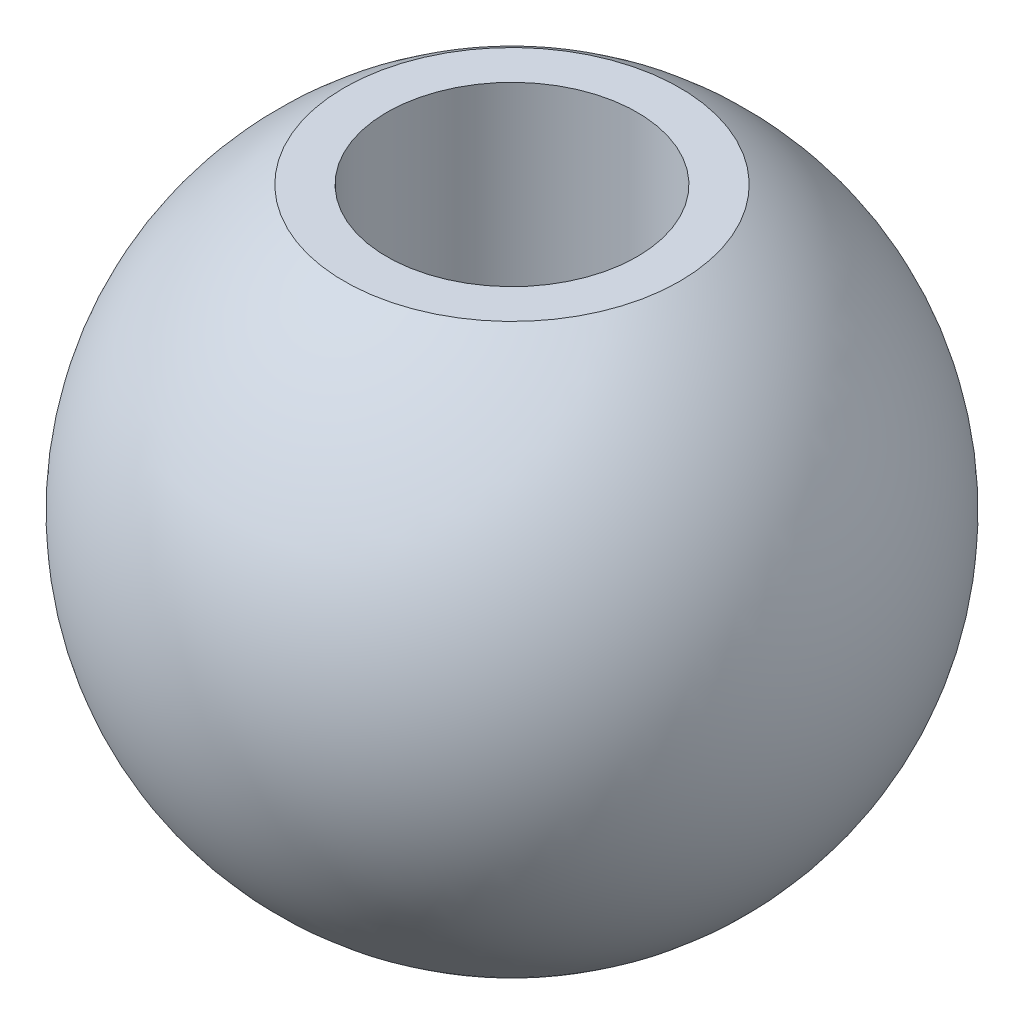
ISO-10303-21;
HEADER;
FILE_DESCRIPTION(('STEP AP214'),'2;1');
FILE_NAME('part.step','',(''),(''),'','','');
FILE_SCHEMA(('AUTOMOTIVE_DESIGN { 1 0 10303 214 1 1 1 1 }'));
ENDSEC;
DATA;
#1=APPLICATION_CONTEXT('core data for automotive mechanical design processes');
#2=APPLICATION_PROTOCOL_DEFINITION('international standard','automotive_design',2000,#1);
#3=PRODUCT_CONTEXT('',#1,'mechanical');
#4=PRODUCT('Part','Part','',(#3));
#5=PRODUCT_RELATED_PRODUCT_CATEGORY('part','',(#4));
#6=PRODUCT_DEFINITION_FORMATION('','',#4);
#7=PRODUCT_DEFINITION_CONTEXT('part definition',#1,'design');
#8=PRODUCT_DEFINITION('design','',#6,#7);
#9=PRODUCT_DEFINITION_SHAPE('','',#8);
#10=(LENGTH_UNIT() NAMED_UNIT(*) SI_UNIT(.MILLI.,.METRE.));
#11=(NAMED_UNIT(*) PLANE_ANGLE_UNIT() SI_UNIT($,.RADIAN.));
#12=(NAMED_UNIT(*) SI_UNIT($,.STERADIAN.) SOLID_ANGLE_UNIT());
#13=UNCERTAINTY_MEASURE_WITH_UNIT(LENGTH_MEASURE(1.E-05),#10,'distance_accuracy_value','');
#14=(GEOMETRIC_REPRESENTATION_CONTEXT(3) GLOBAL_UNCERTAINTY_ASSIGNED_CONTEXT((#13)) GLOBAL_UNIT_ASSIGNED_CONTEXT((#10,
#11,#12)) REPRESENTATION_CONTEXT('',''));
#15=CARTESIAN_POINT('',(0.,0.,0.));
#16=DIRECTION('',(0.,0.,1.));
#17=DIRECTION('',(1.,0.,0.));
#18=AXIS2_PLACEMENT_3D('',#15,#16,#17);
#19=CARTESIAN_POINT('',(0.,0.,0.));
#20=DIRECTION('',(0.,1.,0.));
#21=DIRECTION('',(1.,0.,0.));
#22=AXIS2_PLACEMENT_3D('',#19,#20,#21);
#23=SPHERICAL_SURFACE('',#22,3.95);
#24=CARTESIAN_POINT('',(0.,3.4,0.));
#25=DIRECTION('',(0.,1.,0.));
#26=DIRECTION('',(-1.,0.,0.));
#27=AXIS2_PLACEMENT_3D('',#24,#25,#26);
#28=CIRCLE('',#27,2.01059692628831);
#29=CARTESIAN_POINT('',(2.01059692628831,3.4,0.));
#30=VERTEX_POINT('',#29);
#31=EDGE_CURVE('E44',#30,#30,#28,.T.);
#32=CARTESIAN_POINT('',(0.,-3.4,0.));
#33=DIRECTION('',(0.,1.,0.));
#34=DIRECTION('',(-1.,0.,0.));
#35=AXIS2_PLACEMENT_3D('',#32,#33,#34);
#36=CIRCLE('',#35,2.01059692628831);
#37=CARTESIAN_POINT('',(2.01059692628831,-3.4,0.));
#38=VERTEX_POINT('',#37);
#39=EDGE_CURVE('E10',#38,#38,#36,.T.);
#40=CARTESIAN_POINT('',(2.01059692628831,3.4,0.));
#41=CARTESIAN_POINT('',(2.08403642727924,3.3565762334065,0.));
#42=CARTESIAN_POINT('',(2.15606437943938,3.31076639949149,0.));
#43=CARTESIAN_POINT('',(2.29700517886713,3.21458198269347,0.));
#44=CARTESIAN_POINT('',(2.36591802613475,3.16420739981045,0.));
#45=CARTESIAN_POINT('',(2.50033660854649,3.05910087075139,0.));
#46=CARTESIAN_POINT('',(2.56584234369062,3.00436892457535,0.));
#47=CARTESIAN_POINT('',(2.69317249851169,2.890778477271,0.));
#48=CARTESIAN_POINT('',(2.75499691818862,2.83191997614268,0.));
#49=CARTESIAN_POINT('',(2.87470475138612,2.71032317186042,0.));
#50=CARTESIAN_POINT('',(2.93258816490669,2.64758486870647,0.));
#51=CARTESIAN_POINT('',(3.04417108800817,2.51849186636983,0.));
#52=CARTESIAN_POINT('',(3.09787059758909,2.45213716718715,0.));
#53=CARTESIAN_POINT('',(3.20086030850501,2.3160898589322,0.));
#54=CARTESIAN_POINT('',(3.25015050984,2.24639724985994,0.));
#55=CARTESIAN_POINT('',(3.34411472496936,2.10396664445794,0.));
#56=CARTESIAN_POINT('',(3.38878873876373,2.0312286481282,0.));
#57=CARTESIAN_POINT('',(3.47333306995387,1.88301256599266,0.));
#58=CARTESIAN_POINT('',(3.51320338734965,1.80753448018685,0.));
#59=CARTESIAN_POINT('',(3.58797298047779,1.65415501961077,0.));
#60=CARTESIAN_POINT('',(3.62287225621014,1.57625364484049,0.));
#61=CARTESIAN_POINT('',(3.68755328508499,1.41835457747838,0.));
#62=CARTESIAN_POINT('',(3.71733503822748,1.33835688488654,0.));
#63=CARTESIAN_POINT('',(3.77165602059157,1.17660095192271,0.));
#64=CARTESIAN_POINT('',(3.79619524981317,1.09484271155071,0.));
#65=CARTESIAN_POINT('',(3.83992818714321,0.92990884248388,0.));
#66=CARTESIAN_POINT('',(3.85912189525164,0.84673321378905,0.));
#67=CARTESIAN_POINT('',(3.89208322963802,0.67931367667147,0.));
#68=CARTESIAN_POINT('',(3.90585085591597,0.59506976824872,0.));
#69=CARTESIAN_POINT('',(3.92790224052368,0.425867264100632,0.));
#70=CARTESIAN_POINT('',(3.93618599885345,0.340908668375294,0.));
#71=CARTESIAN_POINT('',(3.94723487859161,0.170633381766637,0.));
#72=CARTESIAN_POINT('',(3.95,0.0853166908833184,0.));
#73=CARTESIAN_POINT('',(3.95,-0.0853166908833185,0.));
#74=CARTESIAN_POINT('',(3.94723487859161,-0.170633381766637,0.));
#75=CARTESIAN_POINT('',(3.93618599885345,-0.340908668375294,0.));
#76=CARTESIAN_POINT('',(3.92790224052368,-0.425867264100632,0.));
#77=CARTESIAN_POINT('',(3.90585085591596,-0.595069768248721,0.));
#78=CARTESIAN_POINT('',(3.89208322963802,-0.679313676671471,0.));
#79=CARTESIAN_POINT('',(3.85912189525164,-0.84673321378905,0.));
#80=CARTESIAN_POINT('',(3.83992818714321,-0.92990884248388,0.));
#81=CARTESIAN_POINT('',(3.79619524981317,-1.09484271155071,0.));
#82=CARTESIAN_POINT('',(3.77165602059157,-1.17660095192271,0.));
#83=CARTESIAN_POINT('',(3.71733503822748,-1.33835688488655,0.));
#84=CARTESIAN_POINT('',(3.68755328508499,-1.41835457747838,0.));
#85=CARTESIAN_POINT('',(3.62287225621014,-1.57625364484049,0.));
#86=CARTESIAN_POINT('',(3.58797298047779,-1.65415501961077,0.));
#87=CARTESIAN_POINT('',(3.51320338734965,-1.80753448018685,0.));
#88=CARTESIAN_POINT('',(3.47333306995387,-1.88301256599266,0.));
#89=CARTESIAN_POINT('',(3.38878873876372,-2.0312286481282,0.));
#90=CARTESIAN_POINT('',(3.34411472496936,-2.10396664445795,0.));
#91=CARTESIAN_POINT('',(3.25015050984,-2.24639724985995,0.));
#92=CARTESIAN_POINT('',(3.20086030850501,-2.3160898589322,0.));
#93=CARTESIAN_POINT('',(3.09787059758909,-2.45213716718715,0.));
#94=CARTESIAN_POINT('',(3.04417108800817,-2.51849186636983,0.));
#95=CARTESIAN_POINT('',(2.93258816490669,-2.64758486870647,0.));
#96=CARTESIAN_POINT('',(2.87470475138612,-2.71032317186042,0.));
#97=CARTESIAN_POINT('',(2.75499691818862,-2.83191997614268,0.));
#98=CARTESIAN_POINT('',(2.69317249851169,-2.890778477271,0.));
#99=CARTESIAN_POINT('',(2.56584234369062,-3.00436892457535,0.));
#100=CARTESIAN_POINT('',(2.50033660854649,-3.05910087075139,0.));
#101=CARTESIAN_POINT('',(2.36591802613475,-3.16420739981045,0.));
#102=CARTESIAN_POINT('',(2.29700517886713,-3.21458198269347,0.));
#103=CARTESIAN_POINT('',(2.15606437943938,-3.31076639949149,0.));
#104=CARTESIAN_POINT('',(2.08403642727923,-3.3565762334065,0.));
#105=CARTESIAN_POINT('',(2.01059692628831,-3.4,0.));
#106=B_SPLINE_CURVE_WITH_KNOTS('',3,(#40,#41,#42,#43,#44,#45,#46,#47,#48,#49,#50,#51,#52,#53,
#54,#55,#56,#57,#58,#59,#60,#61,#62,#63,#64,#65,#66,#67,#68,#69,#70,#71,#72,#73,#74,#75,#76,#77,
#78,#79,#80,#81,#82,#83,#84,#85,#86,#87,#88,#89,#90,#91,#92,#93,#94,#95,#96,#97,#98,#99,#100,
#101,#102,#103,#104,#105),.UNSPECIFIED.,.F.,.F.,(4,2,2,2,2,2,2,2,2,2,2,2,2,2,2,2,2,2,2,2,2,2,2,
2,2,2,2,2,2,2,2,2,4),(0.,0.255905322516015,0.511810645032029,0.767715967548043,1.02362129006406,
1.27952661258007,1.53543193509609,1.7913372576121,2.04724258012811,2.30314790264413,
2.55905322516014,2.81495854767616,3.07086387019217,3.32676919270819,3.5826745152242,
3.83857983774021,4.09448516025623,4.35039048277224,4.60629580528826,4.86220112780427,
5.11810645032028,5.3740117728363,5.62991709535231,5.88582241786833,6.14172774038434,
6.39763306290036,6.65353838541637,6.90944370793239,7.1653490304484,7.42125435296441,
7.67715967548043,7.93306499799644,8.18897032051246),.UNSPECIFIED.);
#107=EDGE_CURVE('BSEAM30',#30,#38,#106,.T.);
#108=ORIENTED_EDGE('',*,*,#31,.F.);
#109=ORIENTED_EDGE('',*,*,#39,.T.);
#110=ORIENTED_EDGE('',*,*,#107,.T.);
#111=ORIENTED_EDGE('',*,*,#107,.F.);
#112=EDGE_LOOP('',(#108,#110,#109,#111));
#113=FACE_BOUND('',#112,.T.);
#114=ADVANCED_FACE('F30',(#113),#23,.T.);
#115=CARTESIAN_POINT('',(1.5,-3.4,0.));
#116=DIRECTION('',(0.,1.,0.));
#117=DIRECTION('',(-1.,0.,0.));
#118=AXIS2_PLACEMENT_3D('',#115,#116,#117);
#119=PLANE('',#118);
#120=ORIENTED_EDGE('',*,*,#39,.F.);
#121=EDGE_LOOP('',(#120));
#122=FACE_BOUND('',#121,.T.);
#123=CARTESIAN_POINT('',(0.,-3.4,0.));
#124=DIRECTION('',(0.,1.,0.));
#125=DIRECTION('',(-1.,0.,0.));
#126=AXIS2_PLACEMENT_3D('',#123,#124,#125);
#127=CIRCLE('',#126,1.5);
#128=CARTESIAN_POINT('',(-1.5,-3.4,0.));
#129=VERTEX_POINT('',#128);
#130=EDGE_CURVE('E36',#129,#129,#127,.T.);
#131=ORIENTED_EDGE('',*,*,#130,.T.);
#132=EDGE_LOOP('',(#131));
#133=FACE_BOUND('',#132,.T.);
#134=ADVANCED_FACE('F53',(#122,#133),#119,.F.);
#135=CARTESIAN_POINT('',(0.,3.4,0.));
#136=DIRECTION('',(0.,1.,0.));
#137=DIRECTION('',(-1.,0.,0.));
#138=AXIS2_PLACEMENT_3D('',#135,#136,#137);
#139=CYLINDRICAL_SURFACE('',#138,1.5);
#140=ORIENTED_EDGE('',*,*,#130,.F.);
#141=EDGE_LOOP('',(#140));
#142=FACE_BOUND('',#141,.T.);
#143=CARTESIAN_POINT('',(0.,3.4,0.));
#144=DIRECTION('',(0.,1.,0.));
#145=DIRECTION('',(-1.,0.,0.));
#146=AXIS2_PLACEMENT_3D('',#143,#144,#145);
#147=CIRCLE('',#146,1.5);
#148=CARTESIAN_POINT('',(-1.5,3.4,0.));
#149=VERTEX_POINT('',#148);
#150=EDGE_CURVE('E40',#149,#149,#147,.T.);
#151=ORIENTED_EDGE('',*,*,#150,.T.);
#152=EDGE_LOOP('',(#151));
#153=FACE_BOUND('',#152,.T.);
#154=ADVANCED_FACE('F57',(#142,#153),#139,.F.);
#155=CARTESIAN_POINT('',(2.01059692628831,3.4,0.));
#156=DIRECTION('',(0.,-1.,0.));
#157=DIRECTION('',(1.,0.,0.));
#158=AXIS2_PLACEMENT_3D('',#155,#156,#157);
#159=PLANE('',#158);
#160=ORIENTED_EDGE('',*,*,#150,.F.);
#161=EDGE_LOOP('',(#160));
#162=FACE_BOUND('',#161,.T.);
#163=ORIENTED_EDGE('',*,*,#31,.T.);
#164=EDGE_LOOP('',(#163));
#165=FACE_BOUND('',#164,.T.);
#166=ADVANCED_FACE('F50',(#162,#165),#159,.F.);
#167=CLOSED_SHELL('',(#114,#134,#154,#166));
#168=MANIFOLD_SOLID_BREP('B2',#167);
#169=ADVANCED_BREP_SHAPE_REPRESENTATION('',(#18,#168),#14);
#170=SHAPE_DEFINITION_REPRESENTATION(#9,#169);
ENDSEC;
END-ISO-10303-21;
